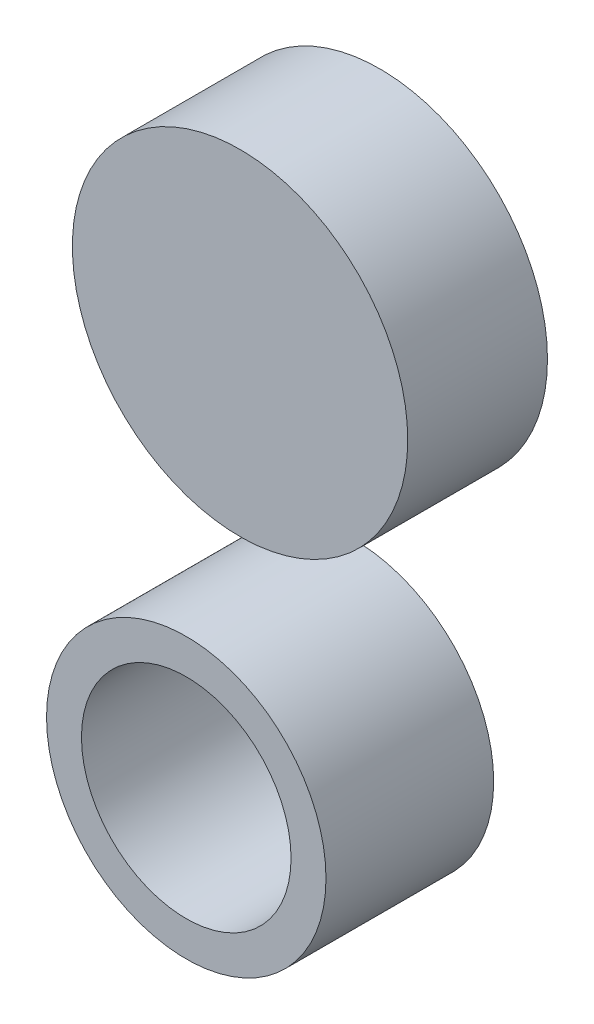
ISO-10303-21;
HEADER;
FILE_DESCRIPTION(('STEP AP214'),'2;1');
FILE_NAME('part.step','',(''),(''),'','','');
FILE_SCHEMA(('AUTOMOTIVE_DESIGN { 1 0 10303 214 1 1 1 1 }'));
ENDSEC;
DATA;
#1=APPLICATION_CONTEXT('core data for automotive mechanical design processes');
#2=APPLICATION_PROTOCOL_DEFINITION('international standard','automotive_design',2000,#1);
#3=PRODUCT_CONTEXT('',#1,'mechanical');
#4=PRODUCT('Part','Part','',(#3));
#5=PRODUCT_RELATED_PRODUCT_CATEGORY('part','',(#4));
#6=PRODUCT_DEFINITION_FORMATION('','',#4);
#7=PRODUCT_DEFINITION_CONTEXT('part definition',#1,'design');
#8=PRODUCT_DEFINITION('design','',#6,#7);
#9=PRODUCT_DEFINITION_SHAPE('','',#8);
#10=(LENGTH_UNIT() NAMED_UNIT(*) SI_UNIT(.MILLI.,.METRE.));
#11=(NAMED_UNIT(*) PLANE_ANGLE_UNIT() SI_UNIT($,.RADIAN.));
#12=(NAMED_UNIT(*) SI_UNIT($,.STERADIAN.) SOLID_ANGLE_UNIT());
#13=UNCERTAINTY_MEASURE_WITH_UNIT(LENGTH_MEASURE(1.E-05),#10,'distance_accuracy_value','');
#14=(GEOMETRIC_REPRESENTATION_CONTEXT(3) GLOBAL_UNCERTAINTY_ASSIGNED_CONTEXT((#13)) GLOBAL_UNIT_ASSIGNED_CONTEXT((#10,
#11,#12)) REPRESENTATION_CONTEXT('',''));
#15=CARTESIAN_POINT('',(0.,0.,0.));
#16=DIRECTION('',(0.,0.,1.));
#17=DIRECTION('',(1.,0.,0.));
#18=AXIS2_PLACEMENT_3D('',#15,#16,#17);
#19=CARTESIAN_POINT('',(1.85019794140934,28.1046296296296,10.));
#20=DIRECTION('',(0.,0.,-1.));
#21=DIRECTION('',(-1.,0.,0.));
#22=AXIS2_PLACEMENT_3D('',#19,#20,#21);
#23=CYLINDRICAL_SURFACE('',#22,12.);
#24=CARTESIAN_POINT('',(1.85019794140934,28.1046296296296,10.));
#25=DIRECTION('',(0.,0.,1.));
#26=DIRECTION('',(1.,0.,0.));
#27=AXIS2_PLACEMENT_3D('',#24,#25,#26);
#28=CIRCLE('',#27,12.);
#29=CARTESIAN_POINT('',(13.8501979414093,28.1046296296296,10.));
#30=VERTEX_POINT('',#29);
#31=EDGE_CURVE('E11',#30,#30,#28,.T.);
#32=ORIENTED_EDGE('',*,*,#31,.F.);
#33=EDGE_LOOP('',(#32));
#34=FACE_BOUND('',#33,.T.);
#35=CARTESIAN_POINT('',(1.85019794140934,28.1046296296296,0.));
#36=DIRECTION('',(0.,0.,1.));
#37=DIRECTION('',(1.,0.,0.));
#38=AXIS2_PLACEMENT_3D('',#35,#36,#37);
#39=CIRCLE('',#38,12.);
#40=CARTESIAN_POINT('',(13.8501979414093,28.1046296296296,0.));
#41=VERTEX_POINT('',#40);
#42=EDGE_CURVE('E46',#41,#41,#39,.T.);
#43=ORIENTED_EDGE('',*,*,#42,.T.);
#44=EDGE_LOOP('',(#43));
#45=FACE_BOUND('',#44,.T.);
#46=ADVANCED_FACE('F43',(#34,#45),#23,.T.);
#47=CARTESIAN_POINT('',(1.85019794140934,28.1046296296296,10.));
#48=DIRECTION('',(0.,0.,1.));
#49=DIRECTION('',(1.,0.,0.));
#50=AXIS2_PLACEMENT_3D('',#47,#48,#49);
#51=PLANE('',#50);
#52=ORIENTED_EDGE('',*,*,#31,.T.);
#53=EDGE_LOOP('',(#52));
#54=FACE_BOUND('',#53,.T.);
#55=ADVANCED_FACE('F58',(#54),#51,.T.);
#56=CARTESIAN_POINT('',(1.85019794140934,28.1046296296296,0.));
#57=DIRECTION('',(0.,0.,1.));
#58=DIRECTION('',(1.,0.,0.));
#59=AXIS2_PLACEMENT_3D('',#56,#57,#58);
#60=PLANE('',#59);
#61=ORIENTED_EDGE('',*,*,#42,.F.);
#62=EDGE_LOOP('',(#61));
#63=FACE_BOUND('',#62,.T.);
#64=ADVANCED_FACE('F56',(#63),#60,.F.);
#65=CLOSED_SHELL('',(#46,#55,#64));
#66=MANIFOLD_SOLID_BREP('B2',#65);
#67=CARTESIAN_POINT('',(0.,0.,12.));
#68=DIRECTION('',(0.,0.,1.));
#69=DIRECTION('',(1.,0.,0.));
#70=AXIS2_PLACEMENT_3D('',#67,#68,#69);
#71=PLANE('',#70);
#72=CARTESIAN_POINT('',(0.,0.,12.));
#73=DIRECTION('',(0.,0.,1.));
#74=DIRECTION('',(1.,0.,0.));
#75=AXIS2_PLACEMENT_3D('',#72,#73,#74);
#76=CIRCLE('',#75,10.);
#77=CARTESIAN_POINT('',(10.,0.,12.));
#78=VERTEX_POINT('',#77);
#79=EDGE_CURVE('E42',#78,#78,#76,.T.);
#80=ORIENTED_EDGE('',*,*,#79,.T.);
#81=EDGE_LOOP('',(#80));
#82=FACE_BOUND('',#81,.T.);
#83=CARTESIAN_POINT('',(0.,0.,12.));
#84=DIRECTION('',(0.,0.,1.));
#85=DIRECTION('',(1.,0.,0.));
#86=AXIS2_PLACEMENT_3D('',#83,#84,#85);
#87=CIRCLE('',#86,7.5);
#88=CARTESIAN_POINT('',(7.5,0.,12.));
#89=VERTEX_POINT('',#88);
#90=EDGE_CURVE('E94',#89,#89,#87,.T.);
#91=ORIENTED_EDGE('',*,*,#90,.F.);
#92=EDGE_LOOP('',(#91));
#93=FACE_BOUND('',#92,.T.);
#94=ADVANCED_FACE('F83',(#82,#93),#71,.T.);
#95=CARTESIAN_POINT('',(0.,0.,0.));
#96=DIRECTION('',(0.,0.,1.));
#97=DIRECTION('',(1.,0.,0.));
#98=AXIS2_PLACEMENT_3D('',#95,#96,#97);
#99=PLANE('',#98);
#100=CARTESIAN_POINT('',(0.,0.,0.));
#101=DIRECTION('',(0.,0.,1.));
#102=DIRECTION('',(1.,0.,0.));
#103=AXIS2_PLACEMENT_3D('',#100,#101,#102);
#104=CIRCLE('',#103,10.);
#105=CARTESIAN_POINT('',(10.,0.,0.));
#106=VERTEX_POINT('',#105);
#107=EDGE_CURVE('E87',#106,#106,#104,.T.);
#108=ORIENTED_EDGE('',*,*,#107,.F.);
#109=EDGE_LOOP('',(#108));
#110=FACE_BOUND('',#109,.T.);
#111=CARTESIAN_POINT('',(0.,0.,0.));
#112=DIRECTION('',(0.,0.,1.));
#113=DIRECTION('',(1.,0.,0.));
#114=AXIS2_PLACEMENT_3D('',#111,#112,#113);
#115=CIRCLE('',#114,7.5);
#116=CARTESIAN_POINT('',(7.5,0.,0.));
#117=VERTEX_POINT('',#116);
#118=EDGE_CURVE('E96',#117,#117,#115,.T.);
#119=ORIENTED_EDGE('',*,*,#118,.T.);
#120=EDGE_LOOP('',(#119));
#121=FACE_BOUND('',#120,.T.);
#122=ADVANCED_FACE('F106',(#110,#121),#99,.F.);
#123=CARTESIAN_POINT('',(0.,0.,12.));
#124=DIRECTION('',(0.,0.,-1.));
#125=DIRECTION('',(-1.,0.,0.));
#126=AXIS2_PLACEMENT_3D('',#123,#124,#125);
#127=CYLINDRICAL_SURFACE('',#126,10.);
#128=ORIENTED_EDGE('',*,*,#79,.F.);
#129=EDGE_LOOP('',(#128));
#130=FACE_BOUND('',#129,.T.);
#131=ORIENTED_EDGE('',*,*,#107,.T.);
#132=EDGE_LOOP('',(#131));
#133=FACE_BOUND('',#132,.T.);
#134=ADVANCED_FACE('F85',(#130,#133),#127,.T.);
#135=CARTESIAN_POINT('',(0.,0.,12.));
#136=DIRECTION('',(0.,0.,-1.));
#137=DIRECTION('',(-1.,0.,0.));
#138=AXIS2_PLACEMENT_3D('',#135,#136,#137);
#139=CYLINDRICAL_SURFACE('',#138,7.5);
#140=ORIENTED_EDGE('',*,*,#90,.T.);
#141=EDGE_LOOP('',(#140));
#142=FACE_BOUND('',#141,.T.);
#143=ORIENTED_EDGE('',*,*,#118,.F.);
#144=EDGE_LOOP('',(#143));
#145=FACE_BOUND('',#144,.T.);
#146=ADVANCED_FACE('F102',(#142,#145),#139,.F.);
#147=CLOSED_SHELL('',(#94,#122,#134,#146));
#148=MANIFOLD_SOLID_BREP('B6',#147);
#149=ADVANCED_BREP_SHAPE_REPRESENTATION('',(#18,#66,#148),#14);
#150=SHAPE_DEFINITION_REPRESENTATION(#9,#149);
ENDSEC;
END-ISO-10303-21;
